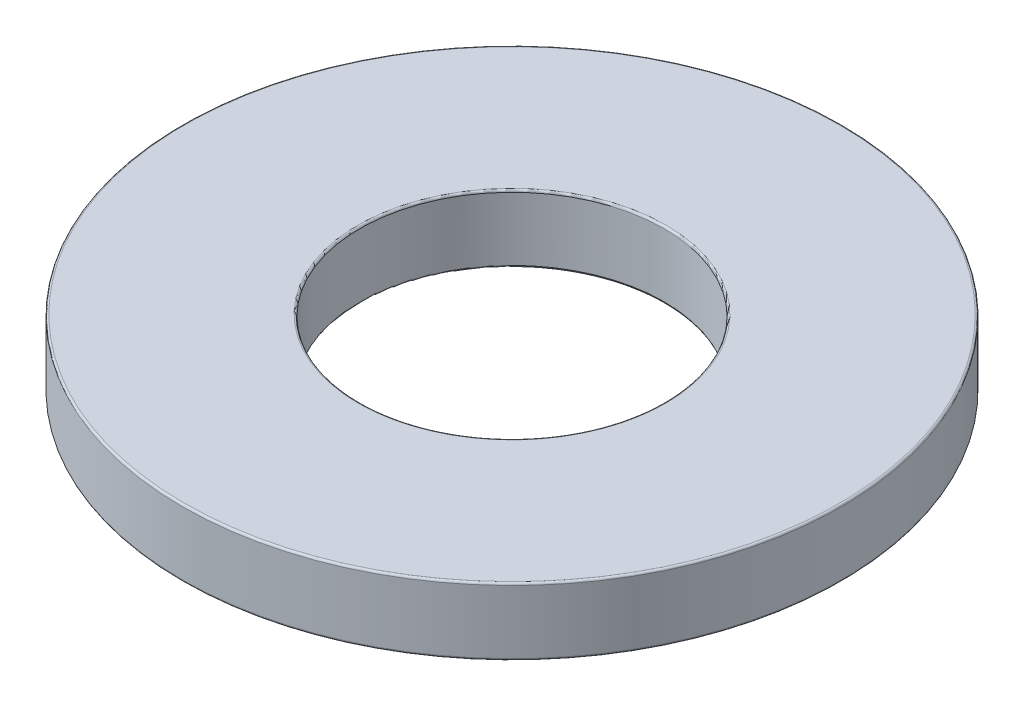
ISO-10303-21;
HEADER;
FILE_DESCRIPTION(('STEP AP214'),'2;1');
FILE_NAME('part.step','',(''),(''),'','','');
FILE_SCHEMA(('AUTOMOTIVE_DESIGN { 1 0 10303 214 1 1 1 1 }'));
ENDSEC;
DATA;
#1=APPLICATION_CONTEXT('core data for automotive mechanical design processes');
#2=APPLICATION_PROTOCOL_DEFINITION('international standard','automotive_design',2000,#1);
#3=PRODUCT_CONTEXT('',#1,'mechanical');
#4=PRODUCT('Part','Part','',(#3));
#5=PRODUCT_RELATED_PRODUCT_CATEGORY('part','',(#4));
#6=PRODUCT_DEFINITION_FORMATION('','',#4);
#7=PRODUCT_DEFINITION_CONTEXT('part definition',#1,'design');
#8=PRODUCT_DEFINITION('design','',#6,#7);
#9=PRODUCT_DEFINITION_SHAPE('','',#8);
#10=(LENGTH_UNIT() NAMED_UNIT(*) SI_UNIT(.MILLI.,.METRE.));
#11=(NAMED_UNIT(*) PLANE_ANGLE_UNIT() SI_UNIT($,.RADIAN.));
#12=(NAMED_UNIT(*) SI_UNIT($,.STERADIAN.) SOLID_ANGLE_UNIT());
#13=UNCERTAINTY_MEASURE_WITH_UNIT(LENGTH_MEASURE(1.E-05),#10,'distance_accuracy_value','');
#14=(GEOMETRIC_REPRESENTATION_CONTEXT(3) GLOBAL_UNCERTAINTY_ASSIGNED_CONTEXT((#13)) GLOBAL_UNIT_ASSIGNED_CONTEXT((#10,
#11,#12)) REPRESENTATION_CONTEXT('',''));
#15=CARTESIAN_POINT('',(0.,0.,0.));
#16=DIRECTION('',(0.,0.,1.));
#17=DIRECTION('',(1.,0.,0.));
#18=AXIS2_PLACEMENT_3D('',#15,#16,#17);
#19=CARTESIAN_POINT('',(0.,1.0541,10.31875));
#20=DIRECTION('',(0.,-1.,0.));
#21=DIRECTION('',(0.,0.,-1.));
#22=AXIS2_PLACEMENT_3D('',#19,#20,#21);
#23=PLANE('',#22);
#24=CARTESIAN_POINT('',(0.,1.0541,0.));
#25=DIRECTION('',(0.,1.,0.));
#26=DIRECTION('',(0.,0.,1.));
#27=AXIS2_PLACEMENT_3D('',#24,#25,#26);
#28=CIRCLE('',#27,10.255504);
#29=CARTESIAN_POINT('',(0.,1.0541,10.255504));
#30=VERTEX_POINT('',#29);
#31=EDGE_CURVE('E38',#30,#30,#28,.T.);
#32=ORIENTED_EDGE('',*,*,#31,.F.);
#33=EDGE_LOOP('',(#32));
#34=FACE_BOUND('',#33,.T.);
#35=CARTESIAN_POINT('',(-4.825746,1.0541,0.));
#36=CARTESIAN_POINT('',(-4.82573899663189,1.05410000000751,-0.0789609550700311));
#37=CARTESIAN_POINT('',(-4.82379098867784,1.05410000178629,-0.157921555383042));
#38=CARTESIAN_POINT('',(-4.81602500662468,1.05410000827055,-0.315651836934031));
#39=CARTESIAN_POINT('',(-4.81020705210106,1.05410001297603,-0.394421519135714));
#40=CARTESIAN_POINT('',(-4.79471325619533,1.0541000246979,-0.551580186577915));
#41=CARTESIAN_POINT('',(-4.78503743302682,1.05410003171428,-0.629969173613986));
#42=CARTESIAN_POINT('',(-4.76185176423513,1.05410004749519,-0.786177713440234));
#43=CARTESIAN_POINT('',(-4.74834193542011,1.05410005625972,-0.863997268725248));
#44=CARTESIAN_POINT('',(-4.71752068022896,1.05410007501306,-1.01887954765831));
#45=CARTESIAN_POINT('',(-4.70020926923696,1.05410008500186,-1.09594227436775));
#46=CARTESIAN_POINT('',(-4.66182660556945,1.05410010572251,-1.24912533116684));
#47=CARTESIAN_POINT('',(-4.64075536684124,1.05410011645436,-1.32524566475123));
#48=CARTESIAN_POINT('',(-4.59490380660667,1.05410013822153,-1.4763606381891));
#49=CARTESIAN_POINT('',(-4.57012349760857,1.05410014925686,-1.55135528183786));
#50=CARTESIAN_POINT('',(-4.51691349746173,1.05410017123332,-1.7000382902726));
#51=CARTESIAN_POINT('',(-4.48848381738928,1.05410018217446,-1.77372665902251));
#52=CARTESIAN_POINT('',(-4.42804355737217,1.05410020360674,-1.91961967830687));
#53=CARTESIAN_POINT('',(-4.39603298708836,1.05410021409788,-1.99182433284359));
#54=CARTESIAN_POINT('',(-4.32850805007814,1.05410023431622,-2.1345760573688));
#55=CARTESIAN_POINT('',(-4.29299369162298,1.05410024404342,-2.20512313126979));
#56=CARTESIAN_POINT('',(-4.21854671606281,1.05410026246178,-2.34438981958064));
#57=CARTESIAN_POINT('',(-4.17961410587438,1.05410027115294,-2.41310943768786));
#58=CARTESIAN_POINT('',(-4.09842439340921,1.05410028726901,-2.54855573969515));
#59=CARTESIAN_POINT('',(-4.05616729673818,1.05410029469391,-2.61528242695541));
#60=CARTESIAN_POINT('',(-3.96843038084777,1.05410030808907,-2.74658219100798));
#61=CARTESIAN_POINT('',(-3.92295056597567,1.05410031405934,-2.81115527070521));
#62=CARTESIAN_POINT('',(-3.82887774126313,1.05410032439874,-2.93799232851281));
#63=CARTESIAN_POINT('',(-3.78028473457234,1.05410032876786,-3.00025630895921));
#64=CARTESIAN_POINT('',(-3.68010254821011,1.05410033580033,-3.12232523649642));
#65=CARTESIAN_POINT('',(-3.62851337055951,1.05410033846366,-3.18213018524573));
#66=CARTESIAN_POINT('',(-3.52246307701721,1.05410034202175,-3.29913703780176));
#67=CARTESIAN_POINT('',(-3.46800196209403,1.05410034291651,-3.35633894248631));
#68=CARTESIAN_POINT('',(-3.3563389424863,1.05410034291651,-3.46800196209405));
#69=CARTESIAN_POINT('',(-3.29913703780174,1.05410034202175,-3.52246307701724));
#70=CARTESIAN_POINT('',(-3.1821301852457,1.05410033846366,-3.62851337055953));
#71=CARTESIAN_POINT('',(-3.1223252364964,1.05410033580033,-3.68010254821012));
#72=CARTESIAN_POINT('',(-3.00025630895918,1.05410032876786,-3.78028473457237));
#73=CARTESIAN_POINT('',(-2.93799232851278,1.05410032439874,-3.82887774126321));
#74=CARTESIAN_POINT('',(-2.81115527070518,1.05410031405934,-3.92295056597564));
#75=CARTESIAN_POINT('',(-2.74658219100794,1.05410030808907,-3.96843038084758));
#76=CARTESIAN_POINT('',(-2.6152824269554,1.05410029469391,-4.0561672967384));
#77=CARTESIAN_POINT('',(-2.54855573969517,1.05410028726901,-4.09842439340999));
#78=CARTESIAN_POINT('',(-2.4131094376878,1.05410027115294,-4.17961410587361));
#79=CARTESIAN_POINT('',(-2.34438981958046,1.05410026246178,-4.21854671605993));
#80=CARTESIAN_POINT('',(-2.20512313126992,1.05410024404342,-4.29299369162589));
#81=CARTESIAN_POINT('',(-2.13457605736934,1.05410023431622,-4.32850805008896));
#82=CARTESIAN_POINT('',(-1.991824332843,1.05410021409788,-4.39603298707757));
#83=CARTESIAN_POINT('',(-1.91961967830472,1.05410020360674,-4.42804355733185));
#84=CARTESIAN_POINT('',(-1.7737266590246,1.05410018217446,-4.48848381742962));
#85=CARTESIAN_POINT('',(-1.70003829028048,1.05410017123332,-4.51691349761226));
#86=CARTESIAN_POINT('',(-1.55135528182993,1.05410014925685,-4.57012349745807));
#87=CARTESIAN_POINT('',(-1.47636063815959,1.05410013822153,-4.59490380604496));
#88=CARTESIAN_POINT('',(-1.32524566478069,1.05410011645436,-4.64075536740296));
#89=CARTESIAN_POINT('',(-1.24912533127687,1.05410010572252,-4.66182660766582));
#90=CARTESIAN_POINT('',(-1.09594227425767,1.05410008500185,-4.70020926714059));
#91=CARTESIAN_POINT('',(-1.01887954724755,1.05410007501302,-4.71752067240517));
#92=CARTESIAN_POINT('',(-0.863997269135952,1.05410005625976,-4.74834194324394));
#93=CARTESIAN_POINT('',(-0.786177714973083,1.05410004749534,-4.76185179343411));
#94=CARTESIAN_POINT('',(-0.629969172081069,1.05410003171413,-4.78503740382773));
#95=CARTESIAN_POINT('',(-0.551580180857064,1.05410002469736,-4.79471314722257));
#96=CARTESIAN_POINT('',(-0.394421524856533,1.05410001297657,-4.81020716107434));
#97=CARTESIAN_POINT('',(-0.315651858284548,1.05410000827257,-4.81602541331942));
#98=CARTESIAN_POINT('',(-0.157921534032358,1.05410000178427,-4.82379058198104));
#99=CARTESIAN_POINT('',(-0.0789608753880744,1.0541,-4.82573747881494));
#100=CARTESIAN_POINT('',(0.0789612880531457,1.0541,-4.8257545212296));
#101=CARTESIAN_POINT('',(0.157922792852347,1.05410000178429,-4.82382464654965));
#102=CARTESIAN_POINT('',(0.315656347190418,1.05410000827258,-4.81609206863876));
#103=CARTESIAN_POINT('',(0.39442839576922,1.0541000129766,-4.81028934582352));
#104=CARTESIAN_POINT('',(0.551593189942901,1.05410002469739,-4.79482520195733));
#105=CARTESIAN_POINT('',(0.629985933745826,1.05410003171417,-4.78516376269459));
#106=CARTESIAN_POINT('',(0.786203179859504,1.05410004749537,-4.76200538514172));
#107=CARTESIAN_POINT('',(0.864027679678396,1.0541000562598,-4.74850843004245));
#108=CARTESIAN_POINT('',(1.0189208683209,1.05410007501306,-4.71771152943103));
#109=CARTESIAN_POINT('',(1.09598955408565,1.05410008500189,-4.70041156853438));
#110=CARTESIAN_POINT('',(1.24918536533432,1.05410010572256,-4.66205031662793));
#111=CARTESIAN_POINT('',(1.32531248732559,1.0541001164544,-4.64098901167026));
#112=CARTESIAN_POINT('',(1.47644169019961,1.05410013822157,-4.59515580452035));
#113=CARTESIAN_POINT('',(1.55144376728881,1.05410014925689,-4.57038388981934));
#114=CARTESIAN_POINT('',(1.70014211038205,1.05410017123335,-4.5171891406686));
#115=CARTESIAN_POINT('',(1.77383837242354,1.05410018217449,-4.4887662951421));
#116=CARTESIAN_POINT('',(1.91974746225472,1.05410020360677,-4.42833816411498));
#117=CARTESIAN_POINT('',(1.9919602860432,1.05410021409791,-4.39633286895305));
#118=CARTESIAN_POINT('',(2.13472845135599,1.05410023431624,-4.32881695522948));
#119=CARTESIAN_POINT('',(2.20528378896858,1.05410024404344,-4.2933063283962));
#120=CARTESIAN_POINT('',(2.3445669288018,1.0541002624618,-4.21886531890027));
#121=CARTESIAN_POINT('',(2.41329472732563,1.05410027115296,-4.17993492932074));
#122=CARTESIAN_POINT('',(2.54875714083259,1.05410028726902,-4.09874820656984));
#123=CARTESIAN_POINT('',(2.61549175245591,1.05410029469392,-4.05649186779252));
#124=CARTESIAN_POINT('',(2.74680694846382,1.05410030808908,-3.96875507737113));
#125=CARTESIAN_POINT('',(2.81138752994371,1.05410031405935,-3.92327462137961));
#126=CARTESIAN_POINT('',(2.93823901430155,1.05410032439874,-3.82919920021034));
#127=CARTESIAN_POINT('',(3.00050991484359,1.05410032876787,-3.78060423188285));
#128=CARTESIAN_POINT('',(3.12259195365827,1.05410033580033,-3.68041689839811));
#129=CARTESIAN_POINT('',(3.18240309027247,1.05410033846366,-3.62882453121999));
#130=CARTESIAN_POINT('',(3.29942144719176,1.05410034202175,-3.5227667386736));
#131=CARTESIAN_POINT('',(3.35662866661904,1.05410034291651,-3.46830131233681));
#132=CARTESIAN_POINT('',(3.46830131238227,1.05410034291651,-3.35662866657207));
#133=CARTESIAN_POINT('',(3.52276673871822,1.05410034202175,-3.29942144714411));
#134=CARTESIAN_POINT('',(3.62882453126281,1.05410033846366,-3.18240309022364));
#135=CARTESIAN_POINT('',(3.68041689843998,1.05410033580033,-3.12259195360894));
#136=CARTESIAN_POINT('',(3.78060423192262,1.05410032876787,-3.00050991479345));
#137=CARTESIAN_POINT('',(3.82919920024898,1.05410032439874,-2.9382390142511));
#138=CARTESIAN_POINT('',(3.92327462141611,1.05410031405935,-2.81138752989286));
#139=CARTESIAN_POINT('',(3.96875507740664,1.05410030808908,-2.74680694841288));
#140=CARTESIAN_POINT('',(4.0564918678251,1.05410029469392,-2.61549175240496));
#141=CARTESIAN_POINT('',(4.09874820660048,1.05410028726902,-2.54875714078173));
#142=CARTESIAN_POINT('',(4.17993492935073,1.05410027115296,-2.41329472727532));
#143=CARTESIAN_POINT('',(4.21886531893154,1.0541002624618,-2.34456692875196));
#144=CARTESIAN_POINT('',(4.29330632841789,1.05410024404344,-2.20528378891936));
#145=CARTESIAN_POINT('',(4.32881695524032,1.05410023431624,-2.13472845130691));
#146=CARTESIAN_POINT('',(4.3963328689874,1.05410021409791,-1.99196028599675));
#147=CARTESIAN_POINT('',(4.42833816418368,1.05410020360677,-1.91974746221075));
#148=CARTESIAN_POINT('',(4.48876629511091,1.05410018217449,-1.77383837237696));
#149=CARTESIAN_POINT('',(4.51718914050316,1.05410017123335,-1.70014211033039));
#150=CARTESIAN_POINT('',(4.57038389001487,1.05410014925689,-1.55144376725637));
#151=CARTESIAN_POINT('',(4.59515580521111,1.05410013822157,-1.47644169019148));
#152=CARTESIAN_POINT('',(4.64098901100262,1.0541001164544,-1.32531248725753));
#153=CARTESIAN_POINT('',(4.66205031410667,1.05410010572255,-1.24918536518202));
#154=CARTESIAN_POINT('',(4.70041157107236,1.0541000850019,-1.09598955417113));
#155=CARTESIAN_POINT('',(4.71771153888183,1.0541000750131,-1.01892086872839));
#156=CARTESIAN_POINT('',(4.74850842060284,1.05410005625976,-0.864027679214875));
#157=CARTESIAN_POINT('',(4.76200534989901,1.05410004749523,-0.786203178202958));
#158=CARTESIAN_POINT('',(4.78516379794365,1.05410003171431,-0.629985935358496));
#159=CARTESIAN_POINT('',(4.79482533350075,1.05410002469793,-0.551593196017789));
#160=CARTESIAN_POINT('',(4.81028921428372,1.05410001297606,-0.394428389663957));
#161=CARTESIAN_POINT('',(4.81609157772356,1.05410000827057,-0.315656324442887));
#162=CARTESIAN_POINT('',(4.82382513746314,1.0541000017863,-0.157922815584055));
#163=CARTESIAN_POINT('',(4.82575635333858,1.05410000000752,-0.0789613729059613));
#164=CARTESIAN_POINT('',(4.825746,1.0541,0.));
#165=B_SPLINE_CURVE_WITH_KNOTS('',3,(#35,#36,#37,#38,#39,#40,#41,#42,#43,#44,#45,#46,#47,#48,
#49,#50,#51,#52,#53,#54,#55,#56,#57,#58,#59,#60,#61,#62,#63,#64,#65,#66,#67,#68,#69,#70,#71,#72,
#73,#74,#75,#76,#77,#78,#79,#80,#81,#82,#83,#84,#85,#86,#87,#88,#89,#90,#91,#92,#93,#94,#95,#96,
#97,#98,#99,#100,#101,#102,#103,#104,#105,#106,#107,#108,#109,#110,#111,#112,#113,#114,#115,
#116,#117,#118,#119,#120,#121,#122,#123,#124,#125,#126,#127,#128,#129,#130,#131,#132,#133,#134,
#135,#136,#137,#138,#139,#140,#141,#142,#143,#144,#145,#146,#147,#148,#149,#150,#151,#152,#153,
#154,#155,#156,#157,#158,#159,#160,#161,#162,#163,#164),.UNSPECIFIED.,.F.,.F.,(4,2,2,2,2,2,2,2,
2,2,2,2,2,2,2,2,2,2,2,2,2,2,2,2,2,2,2,2,2,2,2,2,2,2,2,2,2,2,2,2,2,2,2,2,2,2,2,2,2,2,2,2,2,2,2,2,
2,2,2,2,2,2,2,2,4),(0.,0.236858853167517,0.473716508231896,0.710573045066921,0.947428543546437,
1.18428308354435,1.42113674493451,1.65798960759077,1.89484175138688,2.13169325619651,
2.36854420189326,2.6053946683506,2.84224473544194,3.07909448304059,3.31594399101977,
3.55279333925269,3.78964260761249,4.02649187597228,4.2633412242052,4.50019073218439,
4.73704047978303,4.97389054687437,5.21074101333171,5.44759195902846,5.68444346383809,
5.9212956076342,6.15814847029046,6.39500213168062,6.63185667167853,6.86871217015806,
7.10556870699308,7.34242636205746,7.57928521522497,7.81614530626329,8.05300659506937,
8.28986900179178,8.52673244657899,8.76359684957946,9.00046213094166,9.2373282108141,
9.47419500934536,9.71106244668412,9.94793044297911,10.1847989183792,10.4216677930333,
10.6585369870906,10.8954064206999,11.1322760140107,11.3691456871719,11.6060153603329,
11.8428849536428,12.079754387251,12.3166235813064,12.5534924559582,12.7903609313555,
13.0272289276472,13.2640963649821,13.500963163509,13.7378292433766,13.9746945247335,
14.211558927728,14.4484223725089,14.6852847792244,14.922146068023,15.1590061590534),.UNSPECIFIED.);
#166=CARTESIAN_POINT('',(-4.825746,1.0541,0.));
#167=VERTEX_POINT('',#166);
#168=CARTESIAN_POINT('',(4.825746,1.0541,0.));
#169=VERTEX_POINT('',#168);
#170=EDGE_CURVE('E37',#167,#169,#165,.T.);
#171=ORIENTED_EDGE('',*,*,#170,.F.);
#172=CARTESIAN_POINT('',(0.,1.0541,0.));
#173=DIRECTION('',(0.,1.,0.));
#174=DIRECTION('',(0.,0.,1.));
#175=AXIS2_PLACEMENT_3D('',#172,#173,#174);
#176=CIRCLE('',#175,4.825746);
#177=EDGE_CURVE('E21',#169,#167,#176,.F.);
#178=ORIENTED_EDGE('',*,*,#177,.F.);
#179=EDGE_LOOP('',(#171,#178));
#180=FACE_BOUND('',#179,.T.);
#181=ADVANCED_FACE('F17',(#34,#180),#23,.T.);
#182=CARTESIAN_POINT('',(0.,1.117346,0.));
#183=DIRECTION('',(0.,1.,0.));
#184=DIRECTION('',(0.,0.,1.));
#185=AXIS2_PLACEMENT_3D('',#182,#183,#184);
#186=TOROIDAL_SURFACE('',#185,4.825746,0.0632460000000002);
#187=ORIENTED_EDGE('',*,*,#177,.T.);
#188=ORIENTED_EDGE('',*,*,#170,.T.);
#189=EDGE_LOOP('',(#187,#188));
#190=FACE_BOUND('',#189,.T.);
#191=CARTESIAN_POINT('',(0.,1.117346,0.));
#192=DIRECTION('',(0.,-1.,0.));
#193=DIRECTION('',(0.,0.,-1.));
#194=AXIS2_PLACEMENT_3D('',#191,#192,#193);
#195=CIRCLE('',#194,4.7625);
#196=CARTESIAN_POINT('',(0.,1.117346,-4.7625));
#197=VERTEX_POINT('',#196);
#198=EDGE_CURVE('E41',#197,#197,#195,.F.);
#199=ORIENTED_EDGE('',*,*,#198,.T.);
#200=EDGE_LOOP('',(#199));
#201=FACE_BOUND('',#200,.T.);
#202=ADVANCED_FACE('F35',(#190,#201),#186,.T.);
#203=CARTESIAN_POINT('',(0.,1.117346,0.));
#204=DIRECTION('',(0.,1.,0.));
#205=DIRECTION('',(0.,0.,1.));
#206=AXIS2_PLACEMENT_3D('',#203,#204,#205);
#207=TOROIDAL_SURFACE('',#206,10.255504,0.0632459999999998);
#208=ORIENTED_EDGE('',*,*,#31,.T.);
#209=EDGE_LOOP('',(#208));
#210=FACE_BOUND('',#209,.T.);
#211=CARTESIAN_POINT('',(0.,1.117346,0.));
#212=DIRECTION('',(0.,-1.,0.));
#213=DIRECTION('',(0.,0.,-1.));
#214=AXIS2_PLACEMENT_3D('',#211,#212,#213);
#215=CIRCLE('',#214,10.31875);
#216=CARTESIAN_POINT('',(0.,1.117346,-10.31875));
#217=VERTEX_POINT('',#216);
#218=EDGE_CURVE('E92',#217,#217,#215,.F.);
#219=ORIENTED_EDGE('',*,*,#218,.F.);
#220=EDGE_LOOP('',(#219));
#221=FACE_BOUND('',#220,.T.);
#222=ADVANCED_FACE('F56',(#210,#221),#207,.T.);
#223=CARTESIAN_POINT('',(0.,-3.1623,0.));
#224=DIRECTION('',(0.,-1.,0.));
#225=DIRECTION('',(0.,0.,-1.));
#226=AXIS2_PLACEMENT_3D('',#223,#224,#225);
#227=CYLINDRICAL_SURFACE('',#226,4.7625);
#228=CARTESIAN_POINT('',(0.,3.099054,0.));
#229=DIRECTION('',(0.,-1.,0.));
#230=DIRECTION('',(1.,0.,0.));
#231=AXIS2_PLACEMENT_3D('',#228,#229,#230);
#232=CIRCLE('',#231,4.7625);
#233=CARTESIAN_POINT('',(4.7625,3.099054,0.));
#234=VERTEX_POINT('',#233);
#235=EDGE_CURVE('E89',#234,#234,#232,.T.);
#236=ORIENTED_EDGE('',*,*,#235,.F.);
#237=EDGE_LOOP('',(#236));
#238=FACE_BOUND('',#237,.T.);
#239=ORIENTED_EDGE('',*,*,#198,.F.);
#240=EDGE_LOOP('',(#239));
#241=FACE_BOUND('',#240,.T.);
#242=ADVANCED_FACE('F59',(#238,#241),#227,.F.);
#243=CARTESIAN_POINT('',(0.,-3.1623,0.));
#244=DIRECTION('',(0.,-1.,0.));
#245=DIRECTION('',(0.,0.,-1.));
#246=AXIS2_PLACEMENT_3D('',#243,#244,#245);
#247=CYLINDRICAL_SURFACE('',#246,10.31875);
#248=CARTESIAN_POINT('',(0.,3.099054,0.));
#249=DIRECTION('',(0.,1.,0.));
#250=DIRECTION('',(0.,0.,1.));
#251=AXIS2_PLACEMENT_3D('',#248,#249,#250);
#252=CIRCLE('',#251,10.31875);
#253=CARTESIAN_POINT('',(0.,3.099054,10.31875));
#254=VERTEX_POINT('',#253);
#255=EDGE_CURVE('E96',#254,#254,#252,.T.);
#256=ORIENTED_EDGE('',*,*,#255,.F.);
#257=EDGE_LOOP('',(#256));
#258=FACE_BOUND('',#257,.T.);
#259=ORIENTED_EDGE('',*,*,#218,.T.);
#260=EDGE_LOOP('',(#259));
#261=FACE_BOUND('',#260,.T.);
#262=ADVANCED_FACE('F63',(#258,#261),#247,.T.);
#263=CARTESIAN_POINT('',(0.,3.099054,0.));
#264=DIRECTION('',(0.,-1.,0.));
#265=DIRECTION('',(1.,0.,0.));
#266=AXIS2_PLACEMENT_3D('',#263,#264,#265);
#267=TOROIDAL_SURFACE('',#266,4.825746,0.0632459999999997);
#268=CARTESIAN_POINT('',(0.,3.1623,0.));
#269=DIRECTION('',(0.,-1.,0.));
#270=DIRECTION('',(0.,0.,-1.));
#271=AXIS2_PLACEMENT_3D('',#268,#269,#270);
#272=CIRCLE('',#271,4.825746);
#273=CARTESIAN_POINT('',(0.,3.1623,-4.825746));
#274=VERTEX_POINT('',#273);
#275=EDGE_CURVE('E27',#274,#274,#272,.T.);
#276=ORIENTED_EDGE('',*,*,#275,.F.);
#277=EDGE_LOOP('',(#276));
#278=FACE_BOUND('',#277,.T.);
#279=ORIENTED_EDGE('',*,*,#235,.T.);
#280=EDGE_LOOP('',(#279));
#281=FACE_BOUND('',#280,.T.);
#282=ADVANCED_FACE('F61',(#278,#281),#267,.T.);
#283=CARTESIAN_POINT('',(0.,3.099054,0.));
#284=DIRECTION('',(0.,-1.,0.));
#285=DIRECTION('',(0.,0.,-1.));
#286=AXIS2_PLACEMENT_3D('',#283,#284,#285);
#287=TOROIDAL_SURFACE('',#286,10.255504,0.0632459999999988);
#288=CARTESIAN_POINT('',(0.,3.1623,0.));
#289=DIRECTION('',(0.,-1.,0.));
#290=DIRECTION('',(0.,0.,-1.));
#291=AXIS2_PLACEMENT_3D('',#288,#289,#290);
#292=CIRCLE('',#291,10.255504);
#293=CARTESIAN_POINT('',(0.,3.1623,-10.255504));
#294=VERTEX_POINT('',#293);
#295=EDGE_CURVE('E11',#294,#294,#292,.F.);
#296=ORIENTED_EDGE('',*,*,#295,.F.);
#297=EDGE_LOOP('',(#296));
#298=FACE_BOUND('',#297,.T.);
#299=ORIENTED_EDGE('',*,*,#255,.T.);
#300=EDGE_LOOP('',(#299));
#301=FACE_BOUND('',#300,.T.);
#302=ADVANCED_FACE('F19',(#298,#301),#287,.T.);
#303=CARTESIAN_POINT('',(0.,3.1623,10.31875));
#304=DIRECTION('',(0.,1.,0.));
#305=DIRECTION('',(0.,0.,1.));
#306=AXIS2_PLACEMENT_3D('',#303,#304,#305);
#307=PLANE('',#306);
#308=ORIENTED_EDGE('',*,*,#295,.T.);
#309=EDGE_LOOP('',(#308));
#310=FACE_BOUND('',#309,.T.);
#311=ORIENTED_EDGE('',*,*,#275,.T.);
#312=EDGE_LOOP('',(#311));
#313=FACE_BOUND('',#312,.T.);
#314=ADVANCED_FACE('F70',(#310,#313),#307,.T.);
#315=CLOSED_SHELL('',(#181,#202,#222,#242,#262,#282,#302,#314));
#316=MANIFOLD_SOLID_BREP('B1',#315);
#317=ADVANCED_BREP_SHAPE_REPRESENTATION('',(#18,#316),#14);
#318=SHAPE_DEFINITION_REPRESENTATION(#9,#317);
ENDSEC;
END-ISO-10303-21;
